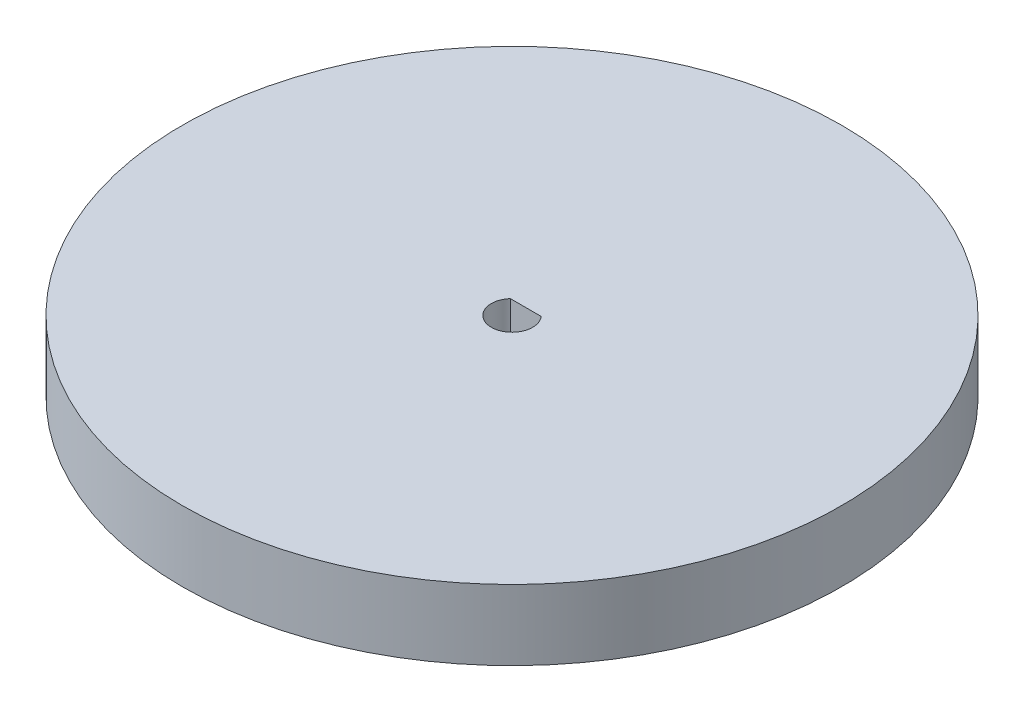
ISO-10303-21;
HEADER;
FILE_DESCRIPTION(('STEP AP214'),'2;1');
FILE_NAME('part.step','',(''),(''),'','','');
FILE_SCHEMA(('AUTOMOTIVE_DESIGN { 1 0 10303 214 1 1 1 1 }'));
ENDSEC;
DATA;
#1=APPLICATION_CONTEXT('core data for automotive mechanical design processes');
#2=APPLICATION_PROTOCOL_DEFINITION('international standard','automotive_design',2000,#1);
#3=PRODUCT_CONTEXT('',#1,'mechanical');
#4=PRODUCT('Part','Part','',(#3));
#5=PRODUCT_RELATED_PRODUCT_CATEGORY('part','',(#4));
#6=PRODUCT_DEFINITION_FORMATION('','',#4);
#7=PRODUCT_DEFINITION_CONTEXT('part definition',#1,'design');
#8=PRODUCT_DEFINITION('design','',#6,#7);
#9=PRODUCT_DEFINITION_SHAPE('','',#8);
#10=(LENGTH_UNIT() NAMED_UNIT(*) SI_UNIT(.MILLI.,.METRE.));
#11=(NAMED_UNIT(*) PLANE_ANGLE_UNIT() SI_UNIT($,.RADIAN.));
#12=(NAMED_UNIT(*) SI_UNIT($,.STERADIAN.) SOLID_ANGLE_UNIT());
#13=UNCERTAINTY_MEASURE_WITH_UNIT(LENGTH_MEASURE(1.E-05),#10,'distance_accuracy_value','');
#14=(GEOMETRIC_REPRESENTATION_CONTEXT(3) GLOBAL_UNCERTAINTY_ASSIGNED_CONTEXT((#13)) GLOBAL_UNIT_ASSIGNED_CONTEXT((#10,
#11,#12)) REPRESENTATION_CONTEXT('',''));
#15=CARTESIAN_POINT('',(0.,0.,0.));
#16=DIRECTION('',(0.,0.,1.));
#17=DIRECTION('',(1.,0.,0.));
#18=AXIS2_PLACEMENT_3D('',#15,#16,#17);
#19=CARTESIAN_POINT('',(0.,5.08,0.));
#20=DIRECTION('',(0.,-1.,0.));
#21=DIRECTION('',(0.,0.,-1.));
#22=AXIS2_PLACEMENT_3D('',#19,#20,#21);
#23=CYLINDRICAL_SURFACE('',#22,23.815610662415);
#24=CARTESIAN_POINT('',(0.,5.08,0.));
#25=DIRECTION('',(0.,1.,0.));
#26=DIRECTION('',(0.,0.,1.));
#27=AXIS2_PLACEMENT_3D('',#24,#25,#26);
#28=CIRCLE('',#27,23.815610662415);
#29=CARTESIAN_POINT('',(0.,5.08,23.815610662415));
#30=VERTEX_POINT('',#29);
#31=EDGE_CURVE('E11',#30,#30,#28,.T.);
#32=ORIENTED_EDGE('',*,*,#31,.F.);
#33=EDGE_LOOP('',(#32));
#34=FACE_BOUND('',#33,.T.);
#35=CARTESIAN_POINT('',(0.,0.,0.));
#36=DIRECTION('',(0.,1.,0.));
#37=DIRECTION('',(0.,0.,1.));
#38=AXIS2_PLACEMENT_3D('',#35,#36,#37);
#39=CIRCLE('',#38,23.815610662415);
#40=CARTESIAN_POINT('',(0.,0.,23.815610662415));
#41=VERTEX_POINT('',#40);
#42=EDGE_CURVE('E36',#41,#41,#39,.T.);
#43=ORIENTED_EDGE('',*,*,#42,.T.);
#44=EDGE_LOOP('',(#43));
#45=FACE_BOUND('',#44,.T.);
#46=ADVANCED_FACE('F33',(#34,#45),#23,.T.);
#47=CARTESIAN_POINT('',(0.,5.08,0.));
#48=DIRECTION('',(0.,1.,0.));
#49=DIRECTION('',(0.,0.,1.));
#50=AXIS2_PLACEMENT_3D('',#47,#48,#49);
#51=PLANE('',#50);
#52=CARTESIAN_POINT('',(0.,5.08,0.));
#53=DIRECTION('',(0.,1.,0.));
#54=DIRECTION('',(0.,0.,1.));
#55=AXIS2_PLACEMENT_3D('',#52,#53,#54);
#56=CIRCLE('',#55,1.49225);
#57=CARTESIAN_POINT('',(-1.11456269451296,5.08,-0.99225));
#58=VERTEX_POINT('',#57);
#59=CARTESIAN_POINT('',(1.11456269451296,5.08,-0.99225));
#60=VERTEX_POINT('',#59);
#61=EDGE_CURVE('E47',#58,#60,#56,.T.);
#62=ORIENTED_EDGE('',*,*,#61,.F.);
#63=DIRECTION('',(-1.,0.,0.));
#64=VECTOR('',#63,1.);
#65=CARTESIAN_POINT('',(-1.11456269451296,5.08,-0.99225));
#66=LINE('',#65,#64);
#67=EDGE_CURVE('E66',#60,#58,#66,.T.);
#68=ORIENTED_EDGE('',*,*,#67,.F.);
#69=EDGE_LOOP('',(#62,#68));
#70=FACE_BOUND('',#69,.T.);
#71=ORIENTED_EDGE('',*,*,#31,.T.);
#72=EDGE_LOOP('',(#71));
#73=FACE_BOUND('',#72,.T.);
#74=ADVANCED_FACE('F70',(#70,#73),#51,.T.);
#75=CARTESIAN_POINT('',(0.,0.,0.));
#76=DIRECTION('',(0.,1.,0.));
#77=DIRECTION('',(0.,0.,1.));
#78=AXIS2_PLACEMENT_3D('',#75,#76,#77);
#79=PLANE('',#78);
#80=DIRECTION('',(-1.,0.,0.));
#81=VECTOR('',#80,1.);
#82=CARTESIAN_POINT('',(-1.11456269451296,0.,-0.99225));
#83=LINE('',#82,#81);
#84=CARTESIAN_POINT('',(1.11456269451296,0.,-0.99225));
#85=VERTEX_POINT('',#84);
#86=CARTESIAN_POINT('',(-1.11456269451296,0.,-0.99225));
#87=VERTEX_POINT('',#86);
#88=EDGE_CURVE('E74',#85,#87,#83,.T.);
#89=ORIENTED_EDGE('',*,*,#88,.T.);
#90=CARTESIAN_POINT('',(0.,0.,0.));
#91=DIRECTION('',(0.,1.,0.));
#92=DIRECTION('',(0.,0.,1.));
#93=AXIS2_PLACEMENT_3D('',#90,#91,#92);
#94=CIRCLE('',#93,1.49225);
#95=EDGE_CURVE('E52',#87,#85,#94,.T.);
#96=ORIENTED_EDGE('',*,*,#95,.T.);
#97=EDGE_LOOP('',(#89,#96));
#98=FACE_BOUND('',#97,.T.);
#99=ORIENTED_EDGE('',*,*,#42,.F.);
#100=EDGE_LOOP('',(#99));
#101=FACE_BOUND('',#100,.T.);
#102=ADVANCED_FACE('F78',(#98,#101),#79,.F.);
#103=CARTESIAN_POINT('',(0.,0.,0.));
#104=DIRECTION('',(0.,1.,0.));
#105=DIRECTION('',(0.,0.,1.));
#106=AXIS2_PLACEMENT_3D('',#103,#104,#105);
#107=CYLINDRICAL_SURFACE('',#106,1.49225);
#108=ORIENTED_EDGE('',*,*,#61,.T.);
#109=DIRECTION('',(0.,1.,0.));
#110=VECTOR('',#109,1.);
#111=CARTESIAN_POINT('',(1.11456269451296,0.,-0.99225));
#112=LINE('',#111,#110);
#113=EDGE_CURVE('E63',#85,#60,#112,.T.);
#114=ORIENTED_EDGE('',*,*,#113,.F.);
#115=ORIENTED_EDGE('',*,*,#95,.F.);
#116=DIRECTION('',(0.,1.,0.));
#117=VECTOR('',#116,1.);
#118=CARTESIAN_POINT('',(-1.11456269451296,0.,-0.99225));
#119=LINE('',#118,#117);
#120=EDGE_CURVE('E57',#87,#58,#119,.T.);
#121=ORIENTED_EDGE('',*,*,#120,.T.);
#122=EDGE_LOOP('',(#108,#114,#115,#121));
#123=FACE_BOUND('',#122,.T.);
#124=ADVANCED_FACE('F59',(#123),#107,.F.);
#125=CARTESIAN_POINT('',(-1.11456269451296,0.,-0.99225));
#126=DIRECTION('',(0.,0.,-1.));
#127=DIRECTION('',(-1.,0.,0.));
#128=AXIS2_PLACEMENT_3D('',#125,#126,#127);
#129=PLANE('',#128);
#130=ORIENTED_EDGE('',*,*,#67,.T.);
#131=ORIENTED_EDGE('',*,*,#120,.F.);
#132=ORIENTED_EDGE('',*,*,#88,.F.);
#133=ORIENTED_EDGE('',*,*,#113,.T.);
#134=EDGE_LOOP('',(#130,#131,#132,#133));
#135=FACE_BOUND('',#134,.T.);
#136=ADVANCED_FACE('F67',(#135),#129,.F.);
#137=CLOSED_SHELL('',(#46,#74,#102,#124,#136));
#138=MANIFOLD_SOLID_BREP('B2',#137);
#139=ADVANCED_BREP_SHAPE_REPRESENTATION('',(#18,#138),#14);
#140=SHAPE_DEFINITION_REPRESENTATION(#9,#139);
ENDSEC;
END-ISO-10303-21;
